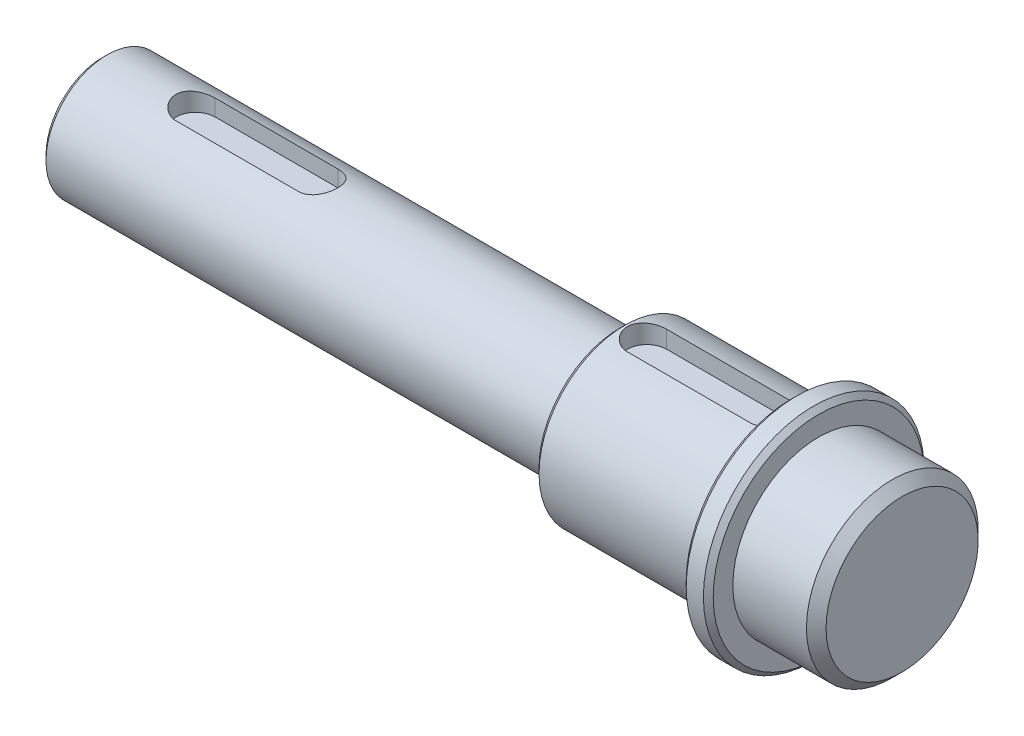
ISO-10303-21;
HEADER;
FILE_DESCRIPTION(('STEP AP214'),'2;1');
FILE_NAME('part.step','',(''),(''),'','','');
FILE_SCHEMA(('AUTOMOTIVE_DESIGN { 1 0 10303 214 1 1 1 1 }'));
ENDSEC;
DATA;
#1=APPLICATION_CONTEXT('core data for automotive mechanical design processes');
#2=APPLICATION_PROTOCOL_DEFINITION('international standard','automotive_design',2000,#1);
#3=PRODUCT_CONTEXT('',#1,'mechanical');
#4=PRODUCT('Part','Part','',(#3));
#5=PRODUCT_RELATED_PRODUCT_CATEGORY('part','',(#4));
#6=PRODUCT_DEFINITION_FORMATION('','',#4);
#7=PRODUCT_DEFINITION_CONTEXT('part definition',#1,'design');
#8=PRODUCT_DEFINITION('design','',#6,#7);
#9=PRODUCT_DEFINITION_SHAPE('','',#8);
#10=(LENGTH_UNIT() NAMED_UNIT(*) SI_UNIT(.MILLI.,.METRE.));
#11=(NAMED_UNIT(*) PLANE_ANGLE_UNIT() SI_UNIT($,.RADIAN.));
#12=(NAMED_UNIT(*) SI_UNIT($,.STERADIAN.) SOLID_ANGLE_UNIT());
#13=UNCERTAINTY_MEASURE_WITH_UNIT(LENGTH_MEASURE(1.E-05),#10,'distance_accuracy_value','');
#14=(GEOMETRIC_REPRESENTATION_CONTEXT(3) GLOBAL_UNCERTAINTY_ASSIGNED_CONTEXT((#13)) GLOBAL_UNIT_ASSIGNED_CONTEXT((#10,
#11,#12)) REPRESENTATION_CONTEXT('',''));
#15=CARTESIAN_POINT('',(0.,0.,0.));
#16=DIRECTION('',(0.,0.,1.));
#17=DIRECTION('',(1.,0.,0.));
#18=AXIS2_PLACEMENT_3D('',#15,#16,#17);
#19=CARTESIAN_POINT('',(-79.2890995260664,0.,0.));
#20=DIRECTION('',(-1.,0.,0.));
#21=DIRECTION('',(0.,0.,1.));
#22=AXIS2_PLACEMENT_3D('',#19,#20,#21);
#23=CYLINDRICAL_SURFACE('',#22,12.4832398510308);
#24=CARTESIAN_POINT('',(-125.043142843842,0.,0.));
#25=DIRECTION('',(-1.,0.,0.));
#26=DIRECTION('',(0.,0.,1.));
#27=AXIS2_PLACEMENT_3D('',#24,#25,#26);
#28=CIRCLE('',#27,12.4832398510308);
#29=CARTESIAN_POINT('',(-125.043142843842,0.,12.4832398510308));
#30=VERTEX_POINT('',#29);
#31=EDGE_CURVE('E11',#30,#30,#28,.F.);
#32=ORIENTED_EDGE('',*,*,#31,.T.);
#33=EDGE_LOOP('',(#32));
#34=FACE_BOUND('',#33,.T.);
#35=DIRECTION('',(-1.,0.,0.));
#36=VECTOR('',#35,1.);
#37=CARTESIAN_POINT('',(-79.2890995260664,11.82502757622,-4.));
#38=LINE('',#37,#36);
#39=CARTESIAN_POINT('',(-107.043142843842,11.82502757622,-4.));
#40=VERTEX_POINT('',#39);
#41=CARTESIAN_POINT('',(-82.0431428438418,11.82502757622,-4.));
#42=VERTEX_POINT('',#41);
#43=EDGE_CURVE('E426',#40,#42,#38,.F.);
#44=ORIENTED_EDGE('',*,*,#43,.T.);
#45=CARTESIAN_POINT('',(-82.0431428438418,11.82502757622,-4.));
#46=CARTESIAN_POINT('',(-81.9337515404454,11.8250110031127,-4.0000141137222));
#47=CARTESIAN_POINT('',(-81.8243695835167,11.8265451313554,-3.99551287069167));
#48=CARTESIAN_POINT('',(-81.6064486273469,11.8325915040989,-3.97758956200591));
#49=CARTESIAN_POINT('',(-81.4979094228663,11.8371029989239,-3.96416974196717));
#50=CARTESIAN_POINT('',(-81.282742261373,11.8489644014943,-3.9285686880446));
#51=CARTESIAN_POINT('',(-81.1761098251397,11.8563063731005,-3.90641194695838));
#52=CARTESIAN_POINT('',(-80.9652252937544,11.8735891478761,-3.8535601719357));
#53=CARTESIAN_POINT('',(-80.8609732751224,11.8835300344618,-3.82286486393878));
#54=CARTESIAN_POINT('',(-80.5529629596767,11.9168131900237,-3.7183665217657));
#55=CARTESIAN_POINT('',(-80.3536498105849,11.9436337977339,-3.63210075005935));
#56=CARTESIAN_POINT('',(-79.972307210485,12.0034992290161,-3.42905556019268));
#57=CARTESIAN_POINT('',(-79.7902874267558,12.03654750352,-3.3122592101887));
#58=CARTESIAN_POINT('',(-79.4420901346098,12.1064743176933,-3.04695637291666));
#59=CARTESIAN_POINT('',(-79.2766218492057,12.1434425605695,-2.89754085181971));
#60=CARTESIAN_POINT('',(-78.9726133889303,12.2162837652139,-2.57318506510693));
#61=CARTESIAN_POINT('',(-78.8340779053559,12.252156535251,-2.39824036195799));
#62=CARTESIAN_POINT('',(-78.5846754431944,12.3198007858832,-2.02262376587463));
#63=CARTESIAN_POINT('',(-78.4745491670526,12.3514537051938,-1.82143677525294));
#64=CARTESIAN_POINT('',(-78.2899839080282,12.4060334467591,-1.40221623014474));
#65=CARTESIAN_POINT('',(-78.2155347049385,12.4289627676248,-1.18418752101579));
#66=CARTESIAN_POINT('',(-78.1068284529817,12.4628752417648,-0.744947594997114));
#67=CARTESIAN_POINT('',(-78.0713496428594,12.474220697158,-0.524067239269295));
#68=CARTESIAN_POINT('',(-78.0377151163119,12.484969242915,-0.0792123550784674));
#69=CARTESIAN_POINT('',(-78.0395512383686,12.4843749447408,0.144761486068363));
#70=CARTESIAN_POINT('',(-78.0797027036522,12.4715602391351,0.580820166039402));
#71=CARTESIAN_POINT('',(-78.116692070213,12.4597624390652,0.793041523725626));
#72=CARTESIAN_POINT('',(-78.2239180802289,12.4263903019181,1.20808577683661));
#73=CARTESIAN_POINT('',(-78.2941565353966,12.4048154320998,1.4109081594585));
#74=CARTESIAN_POINT('',(-78.4667074332672,12.3537570546547,1.80439964540674));
#75=CARTESIAN_POINT('',(-78.5694130730951,12.3241772709371,1.99488329429804));
#76=CARTESIAN_POINT('',(-78.8036735613444,12.2602110735122,2.35631866367431));
#77=CARTESIAN_POINT('',(-78.9352357318324,12.2258234406639,2.52726541008281));
#78=CARTESIAN_POINT('',(-79.2301841181759,12.1541216823786,2.85264514906441));
#79=CARTESIAN_POINT('',(-79.3947081084184,12.1167453325952,3.00603265335917));
#80=CARTESIAN_POINT('',(-79.7476343831557,12.0445394669678,3.28343677036456));
#81=CARTESIAN_POINT('',(-79.9360440113753,12.009710739615,3.40744431631939));
#82=CARTESIAN_POINT('',(-80.2339876148793,11.9622102944545,3.56931543561853));
#83=CARTESIAN_POINT('',(-80.3366127463039,11.9470804599342,3.61950747953244));
#84=CARTESIAN_POINT('',(-80.546015410116,11.918973471828,3.71101626980851));
#85=CARTESIAN_POINT('',(-80.6527912041457,11.9059954287798,3.75233668543145));
#86=CARTESIAN_POINT('',(-80.8696253515857,11.8826265075836,3.82569571603121));
#87=CARTESIAN_POINT('',(-80.9796800457498,11.8722328580563,3.85774427978084));
#88=CARTESIAN_POINT('',(-81.2023156408048,11.8543646460776,3.91230588713122));
#89=CARTESIAN_POINT('',(-81.3148953587383,11.8468887456872,3.934823301659));
#90=CARTESIAN_POINT('',(-81.5299523758392,11.8357237464778,3.96827575654964));
#91=CARTESIAN_POINT('',(-81.6322652618139,11.8317221160491,3.98017046649224));
#92=CARTESIAN_POINT('',(-81.8374303986078,11.826369357653,3.99603268377225));
#93=CARTESIAN_POINT('',(-81.9402817163929,11.8250145993344,4.00001104901215));
#94=CARTESIAN_POINT('',(-82.0431428438418,11.82502757622,4.));
#95=B_SPLINE_CURVE_WITH_KNOTS('',3,(#45,#46,#47,#48,#49,#50,#51,#52,#53,#54,#55,#56,#57,#58,#59,
#60,#61,#62,#63,#64,#65,#66,#67,#68,#69,#70,#71,#72,#73,#74,#75,#76,#77,#78,#79,#80,#81,#82,#83,
#84,#85,#86,#87,#88,#89,#90,#91,#92,#93,#94),.UNSPECIFIED.,.F.,.F.,(4,2,2,2,2,2,2,2,2,2,2,2,2,2,
2,2,2,2,2,2,2,2,2,2,4),(0.,0.32805474326233,0.65602691660654,0.983086126435687,1.31015583502185,
1.96339087140417,2.61698895450837,3.29187832850458,3.9668851531564,4.65803039507009,
5.34897753002623,6.01758311440034,6.68604246300688,7.33024839482757,7.97448943288487,
8.62685249880989,9.27938128746748,9.96037124758603,10.6415710905933,10.9869281381389,
11.3321420714117,11.6769842016827,12.021668017663,12.3305720730896,12.6390521489492),.UNSPECIFIED.);
#96=CARTESIAN_POINT('',(-82.0431428438418,11.82502757622,4.));
#97=VERTEX_POINT('',#96);
#98=EDGE_CURVE('E272',#42,#97,#95,.T.);
#99=ORIENTED_EDGE('',*,*,#98,.T.);
#100=DIRECTION('',(-1.,0.,0.));
#101=VECTOR('',#100,1.);
#102=CARTESIAN_POINT('',(-79.2890995260664,11.82502757622,4.));
#103=LINE('',#102,#101);
#104=CARTESIAN_POINT('',(-107.043142843842,11.82502757622,4.));
#105=VERTEX_POINT('',#104);
#106=EDGE_CURVE('E286',#97,#105,#103,.T.);
#107=ORIENTED_EDGE('',*,*,#106,.T.);
#108=CARTESIAN_POINT('',(-107.043142843842,11.82502757622,4.));
#109=CARTESIAN_POINT('',(-107.152534147238,11.8250110031127,4.0000141137222));
#110=CARTESIAN_POINT('',(-107.261916104167,11.8265451313554,3.99551287069167));
#111=CARTESIAN_POINT('',(-107.479837060337,11.8325915040989,3.97758956200591));
#112=CARTESIAN_POINT('',(-107.588376264817,11.8371029989239,3.96416974196716));
#113=CARTESIAN_POINT('',(-107.803543426311,11.8489644014943,3.9285686880446));
#114=CARTESIAN_POINT('',(-107.910175862544,11.8563063731005,3.90641194695839));
#115=CARTESIAN_POINT('',(-108.121060393929,11.8735891478761,3.8535601719357));
#116=CARTESIAN_POINT('',(-108.225312412561,11.8835300344618,3.82286486393878));
#117=CARTESIAN_POINT('',(-108.533322728007,11.9168131900237,3.7183665217657));
#118=CARTESIAN_POINT('',(-108.732635877099,11.9436337977339,3.63210075005934));
#119=CARTESIAN_POINT('',(-109.113978477199,12.0034992290161,3.42905556019268));
#120=CARTESIAN_POINT('',(-109.295998260928,12.03654750352,3.3122592101887));
#121=CARTESIAN_POINT('',(-109.644195553074,12.1064743176933,3.04695637291666));
#122=CARTESIAN_POINT('',(-109.809663838478,12.1434425605695,2.89754085181969));
#123=CARTESIAN_POINT('',(-110.113672298753,12.2162837652139,2.57318506510691));
#124=CARTESIAN_POINT('',(-110.252207782328,12.252156535251,2.39824036195798));
#125=CARTESIAN_POINT('',(-110.501610244489,12.3198007858832,2.02262376587463));
#126=CARTESIAN_POINT('',(-110.611736520631,12.3514537051938,1.82143677525294));
#127=CARTESIAN_POINT('',(-110.796301779655,12.4060334467591,1.40221623014474));
#128=CARTESIAN_POINT('',(-110.870750982745,12.4289627676248,1.18418752101579));
#129=CARTESIAN_POINT('',(-110.979457234702,12.4628752417648,0.744947594997115));
#130=CARTESIAN_POINT('',(-111.014936044824,12.474220697158,0.524067239269295));
#131=CARTESIAN_POINT('',(-111.048570571372,12.484969242915,0.0792123550784681));
#132=CARTESIAN_POINT('',(-111.046734449315,12.4843749447408,-0.144761486068362));
#133=CARTESIAN_POINT('',(-111.006582984031,12.4715602391351,-0.580820166039402));
#134=CARTESIAN_POINT('',(-110.969593617471,12.4597624390652,-0.793041523725627));
#135=CARTESIAN_POINT('',(-110.862367607455,12.4263903019181,-1.20808577683661));
#136=CARTESIAN_POINT('',(-110.792129152287,12.4048154320998,-1.4109081594585));
#137=CARTESIAN_POINT('',(-110.619578254416,12.3537570546547,-1.80439964540674));
#138=CARTESIAN_POINT('',(-110.516872614588,12.3241772709371,-1.99488329429804));
#139=CARTESIAN_POINT('',(-110.282612126339,12.2602110735122,-2.35631866367431));
#140=CARTESIAN_POINT('',(-110.151049955851,12.2258234406639,-2.52726541008281));
#141=CARTESIAN_POINT('',(-109.856101569508,12.1541216823786,-2.85264514906441));
#142=CARTESIAN_POINT('',(-109.691577579265,12.1167453325952,-3.00603265335918));
#143=CARTESIAN_POINT('',(-109.338651304528,12.0445394669678,-3.28343677036456));
#144=CARTESIAN_POINT('',(-109.150241676308,12.009710739615,-3.40744431631939));
#145=CARTESIAN_POINT('',(-108.852298072804,11.9622102944545,-3.56931543561852));
#146=CARTESIAN_POINT('',(-108.74967294138,11.9470804599342,-3.61950747953244));
#147=CARTESIAN_POINT('',(-108.540270277568,11.918973471828,-3.7110162698085));
#148=CARTESIAN_POINT('',(-108.433494483538,11.9059954287798,-3.75233668543145));
#149=CARTESIAN_POINT('',(-108.216660336098,11.8826265075836,-3.82569571603121));
#150=CARTESIAN_POINT('',(-108.106605641934,11.8722328580563,-3.85774427978084));
#151=CARTESIAN_POINT('',(-107.883970046879,11.8543646460776,-3.91230588713122));
#152=CARTESIAN_POINT('',(-107.771390328945,11.8468887456872,-3.934823301659));
#153=CARTESIAN_POINT('',(-107.556333311844,11.8357237464778,-3.96827575654964));
#154=CARTESIAN_POINT('',(-107.45402042587,11.8317221160491,-3.98017046649224));
#155=CARTESIAN_POINT('',(-107.248855289076,11.826369357653,-3.99603268377225));
#156=CARTESIAN_POINT('',(-107.146003971291,11.8250145993344,-4.00001104901215));
#157=CARTESIAN_POINT('',(-107.043142843842,11.82502757622,-4.));
#158=B_SPLINE_CURVE_WITH_KNOTS('',3,(#108,#109,#110,#111,#112,#113,#114,#115,#116,#117,#118,
#119,#120,#121,#122,#123,#124,#125,#126,#127,#128,#129,#130,#131,#132,#133,#134,#135,#136,#137,
#138,#139,#140,#141,#142,#143,#144,#145,#146,#147,#148,#149,#150,#151,#152,#153,#154,#155,#156,
#157),.UNSPECIFIED.,.F.,.F.,(4,2,2,2,2,2,2,2,2,2,2,2,2,2,2,2,2,2,2,2,2,2,2,2,4),(0.,
0.328054743262344,0.65602691660654,0.983086126435644,1.31015583502185,1.96339087140419,
2.61698895450837,3.29187832850461,3.9668851531564,4.65803039507009,5.34897753002623,
6.01758311440033,6.68604246300688,7.33024839482757,7.97448943288487,8.62685249880989,
9.27938128746748,9.96037124758604,10.6415710905933,10.9869281381389,11.3321420714117,
11.6769842016826,12.021668017663,12.3305720730896,12.6390521489492),.UNSPECIFIED.);
#159=EDGE_CURVE('E51',#105,#40,#158,.T.);
#160=ORIENTED_EDGE('',*,*,#159,.T.);
#161=EDGE_LOOP('',(#44,#99,#107,#160));
#162=FACE_BOUND('',#161,.T.);
#163=CARTESIAN_POINT('',(-20.5512051427925,0.,0.));
#164=DIRECTION('',(-1.,0.,0.));
#165=DIRECTION('',(0.,0.,1.));
#166=AXIS2_PLACEMENT_3D('',#163,#164,#165);
#167=CIRCLE('',#166,12.4832398510308);
#168=CARTESIAN_POINT('',(-20.5512051427925,0.,12.4832398510308));
#169=VERTEX_POINT('',#168);
#170=EDGE_CURVE('E185',#169,#169,#167,.T.);
#171=ORIENTED_EDGE('',*,*,#170,.T.);
#172=EDGE_LOOP('',(#171));
#173=FACE_BOUND('',#172,.T.);
#174=ADVANCED_FACE('F35',(#34,#162,#173),#23,.T.);
#175=CARTESIAN_POINT('',(-20.5447499146006,0.,0.));
#176=DIRECTION('',(1.,0.,0.));
#177=DIRECTION('',(0.,0.,-1.));
#178=AXIS2_PLACEMENT_3D('',#175,#176,#177);
#179=CONICAL_SURFACE('',#178,16.500001291339,1.56918925534429);
#180=ORIENTED_EDGE('',*,*,#170,.F.);
#181=EDGE_LOOP('',(#180));
#182=FACE_BOUND('',#181,.T.);
#183=CARTESIAN_POINT('',(-20.5447499146006,0.,0.));
#184=DIRECTION('',(-1.,0.,0.));
#185=DIRECTION('',(0.,0.,1.));
#186=AXIS2_PLACEMENT_3D('',#183,#184,#185);
#187=CIRCLE('',#186,16.500001291339);
#188=CARTESIAN_POINT('',(-20.5447499146006,0.,16.500001291339));
#189=VERTEX_POINT('',#188);
#190=EDGE_CURVE('E182',#189,#189,#187,.T.);
#191=ORIENTED_EDGE('',*,*,#190,.T.);
#192=EDGE_LOOP('',(#191));
#193=FACE_BOUND('',#192,.T.);
#194=ADVANCED_FACE('F261',(#182,#193),#179,.T.);
#195=CARTESIAN_POINT('',(-19.5431428438418,0.,0.));
#196=DIRECTION('',(1.,0.,0.));
#197=DIRECTION('',(0.,0.,-1.));
#198=AXIS2_PLACEMENT_3D('',#195,#196,#197);
#199=CONICAL_SURFACE('',#198,17.5,0.784594627672144);
#200=ORIENTED_EDGE('',*,*,#190,.F.);
#201=EDGE_LOOP('',(#200));
#202=FACE_BOUND('',#201,.T.);
#203=CARTESIAN_POINT('',(-19.5431428438418,0.,0.));
#204=DIRECTION('',(-1.,0.,0.));
#205=DIRECTION('',(0.,0.,1.));
#206=AXIS2_PLACEMENT_3D('',#203,#204,#205);
#207=CIRCLE('',#206,17.5);
#208=CARTESIAN_POINT('',(-19.5431428438418,0.,17.5));
#209=VERTEX_POINT('',#208);
#210=EDGE_CURVE('E179',#209,#209,#207,.T.);
#211=ORIENTED_EDGE('',*,*,#210,.T.);
#212=EDGE_LOOP('',(#211));
#213=FACE_BOUND('',#212,.T.);
#214=ADVANCED_FACE('F256',(#202,#213),#199,.T.);
#215=CARTESIAN_POINT('',(-79.2890995260664,0.,0.));
#216=DIRECTION('',(-1.,0.,0.));
#217=DIRECTION('',(0.,0.,1.));
#218=AXIS2_PLACEMENT_3D('',#215,#216,#217);
#219=CYLINDRICAL_SURFACE('',#218,17.5);
#220=DIRECTION('',(-1.,0.,0.));
#221=VECTOR('',#220,1.);
#222=CARTESIAN_POINT('',(-79.2890995260664,17.0367250374008,-4.));
#223=LINE('',#222,#221);
#224=CARTESIAN_POINT('',(-15.0331753554502,17.0367250374008,-4.));
#225=VERTEX_POINT('',#224);
#226=CARTESIAN_POINT('',(9.96682464454978,17.0367250374008,-4.));
#227=VERTEX_POINT('',#226);
#228=EDGE_CURVE('E308',#225,#227,#223,.F.);
#229=ORIENTED_EDGE('',*,*,#228,.T.);
#230=CARTESIAN_POINT('',(9.96682464454978,17.0367250374008,-4.));
#231=CARTESIAN_POINT('',(10.0777564935695,17.0367138660067,-4.00001248231751));
#232=CARTESIAN_POINT('',(10.1886811675091,17.0378082617858,-3.99538546502867));
#233=CARTESIAN_POINT('',(10.409707211788,17.0421253952987,-3.97694932157872));
#234=CARTESIAN_POINT('',(10.5198087013615,17.0453478185126,-3.96314155232038));
#235=CARTESIAN_POINT('',(10.7382194094241,17.0538307536469,-3.92647318924765));
#236=CARTESIAN_POINT('',(10.8465314527527,17.059087651771,-3.90362864568808));
#237=CARTESIAN_POINT('',(11.0607655281195,17.0714746819689,-3.8490944107021));
#238=CARTESIAN_POINT('',(11.1666875379353,17.0786048314525,-3.81740463706963));
#239=CARTESIAN_POINT('',(11.4797596464848,17.1025105269156,-3.70940007909276));
#240=CARTESIAN_POINT('',(11.6824139303482,17.1218095761762,-3.6201165136919));
#241=CARTESIAN_POINT('',(12.0698058299077,17.1649441397841,-3.40971418070428));
#242=CARTESIAN_POINT('',(12.2545399685465,17.1887805318677,-3.28858925176468));
#243=CARTESIAN_POINT('',(12.6043307655271,17.2387926899631,-3.01555269417646));
#244=CARTESIAN_POINT('',(12.7690141101875,17.2650004661165,-2.86316778652959));
#245=CARTESIAN_POINT('',(13.0707241607244,17.3165247611238,-2.53295238865313));
#246=CARTESIAN_POINT('',(13.2077465158187,17.3418411392541,-2.3551179029788));
#247=CARTESIAN_POINT('',(13.4517449645885,17.3890809668325,-1.97651609742511));
#248=CARTESIAN_POINT('',(13.558356567215,17.410961949179,-1.77550809318057));
#249=CARTESIAN_POINT('',(13.7361375623255,17.4484992744045,-1.35785483515842));
#250=CARTESIAN_POINT('',(13.8073131356526,17.4641567027157,-1.14121231594595));
#251=CARTESIAN_POINT('',(13.9110196304699,17.4872566687127,-0.702348968435726));
#252=CARTESIAN_POINT('',(13.9441885563998,17.4948346770719,-0.480286158684642));
#253=CARTESIAN_POINT('',(13.9729373029082,17.5013922359856,-0.0336222528298657));
#254=CARTESIAN_POINT('',(13.9685209514387,17.5003726621791,0.190978582456415));
#255=CARTESIAN_POINT('',(13.9226935945377,17.489952340558,0.631926010215037));
#256=CARTESIAN_POINT('',(13.8819714396683,17.4807076590668,0.848348430712727));
#257=CARTESIAN_POINT('',(13.7657886794447,17.4550549045918,1.27120201757733));
#258=CARTESIAN_POINT('',(13.6903266978339,17.4386465478123,1.4776327877559));
#259=CARTESIAN_POINT('',(13.5062143640618,17.4002626903077,1.87652973429281));
#260=CARTESIAN_POINT('',(13.3973072846135,17.3782443578209,2.06887311134545));
#261=CARTESIAN_POINT('',(13.149581632536,17.3310474587669,2.43280009121924));
#262=CARTESIAN_POINT('',(13.0107594550459,17.3058685114888,2.60438118822771));
#263=CARTESIAN_POINT('',(12.7034665097011,17.2544419046369,2.92598580900956));
#264=CARTESIAN_POINT('',(12.5343969069737,17.2281829516239,3.0754348941749));
#265=CARTESIAN_POINT('',(12.173159341539,17.1780692090276,3.34405202485233));
#266=CARTESIAN_POINT('',(11.9809850869103,17.1542150775981,3.46321179425783));
#267=CARTESIAN_POINT('',(11.679202803394,17.1222689727167,3.61671597326183));
#268=CARTESIAN_POINT('',(11.5760743200484,17.1122387789592,3.66376574815988));
#269=CARTESIAN_POINT('',(11.3660864443802,17.0937715302981,3.7489839926838));
#270=CARTESIAN_POINT('',(11.2592285461217,17.0853338458964,3.78715597297674));
#271=CARTESIAN_POINT('',(11.0426572531314,17.0703178704533,3.8542742485837));
#272=CARTESIAN_POINT('',(10.9329469459531,17.0637376534167,3.88323010403838));
#273=CARTESIAN_POINT('',(10.7114056174011,17.0526294698307,3.93172314689819));
#274=CARTESIAN_POINT('',(10.5995756220362,17.0481005355421,3.95126477595514));
#275=CARTESIAN_POINT('',(10.4008275696961,17.0420340571271,3.97733749089981));
#276=CARTESIAN_POINT('',(10.3141762072353,17.0400453891908,3.98583914323426));
#277=CARTESIAN_POINT('',(10.1406273475216,17.0373899876292,3.99716769798061));
#278=CARTESIAN_POINT('',(10.0537304945129,17.0367210727584,4.00000396405785));
#279=CARTESIAN_POINT('',(9.96682464454978,17.0367250374008,4.));
#280=B_SPLINE_CURVE_WITH_KNOTS('',3,(#230,#231,#232,#233,#234,#235,#236,#237,#238,#239,#240,
#241,#242,#243,#244,#245,#246,#247,#248,#249,#250,#251,#252,#253,#254,#255,#256,#257,#258,#259,
#260,#261,#262,#263,#264,#265,#266,#267,#268,#269,#270,#271,#272,#273,#274,#275,#276,#277,#278,
#279),.UNSPECIFIED.,.F.,.F.,(4,2,2,2,2,2,2,2,2,2,2,2,2,2,2,2,2,2,2,2,2,2,2,2,4),(0.,
0.332681247866697,0.66531333682085,0.997357270100381,1.32940428944207,1.99290262989595,
2.65652945292504,3.33106339250549,4.00570334664101,4.68811868485082,5.37041495269124,
6.0410817607265,6.71168026410031,7.36981967360707,8.02798515827641,8.69133469760162,
9.35476421731793,10.0331782060872,10.7117773626502,11.0528239514451,11.3937354453644,
11.7342921410368,12.0746880036043,12.3357711604052,12.5964224446493),.UNSPECIFIED.);
#281=CARTESIAN_POINT('',(9.96682464454978,17.0367250374008,4.));
#282=VERTEX_POINT('',#281);
#283=EDGE_CURVE('E188',#227,#282,#280,.T.);
#284=ORIENTED_EDGE('',*,*,#283,.T.);
#285=DIRECTION('',(-1.,0.,0.));
#286=VECTOR('',#285,1.);
#287=CARTESIAN_POINT('',(-79.2890995260664,17.0367250374008,4.));
#288=LINE('',#287,#286);
#289=CARTESIAN_POINT('',(-15.0331753554502,17.0367250374008,4.));
#290=VERTEX_POINT('',#289);
#291=EDGE_CURVE('E305',#282,#290,#288,.T.);
#292=ORIENTED_EDGE('',*,*,#291,.T.);
#293=CARTESIAN_POINT('',(-15.0331753554502,17.0367250374008,4.));
#294=CARTESIAN_POINT('',(-15.14410720447,17.0367138660067,4.00001248231751));
#295=CARTESIAN_POINT('',(-15.2550318784095,17.0378082617858,3.99538546502866));
#296=CARTESIAN_POINT('',(-15.4760579226884,17.0421253952987,3.97694932157872));
#297=CARTESIAN_POINT('',(-15.5861594122619,17.0453478185126,3.96314155232038));
#298=CARTESIAN_POINT('',(-15.8045701203245,17.0538307536469,3.92647318924765));
#299=CARTESIAN_POINT('',(-15.9128821636531,17.059087651771,3.90362864568808));
#300=CARTESIAN_POINT('',(-16.1271162390199,17.0714746819689,3.8490944107021));
#301=CARTESIAN_POINT('',(-16.2330382488357,17.0786048314525,3.81740463706963));
#302=CARTESIAN_POINT('',(-16.5461103573852,17.1025105269156,3.70940007909276));
#303=CARTESIAN_POINT('',(-16.7487646412487,17.1218095761762,3.6201165136919));
#304=CARTESIAN_POINT('',(-17.1361565408081,17.1649441397841,3.40971418070428));
#305=CARTESIAN_POINT('',(-17.3208906794469,17.1887805318677,3.28858925176468));
#306=CARTESIAN_POINT('',(-17.6706814764275,17.2387926899631,3.01555269417646));
#307=CARTESIAN_POINT('',(-17.835364821088,17.2650004661165,2.8631677865296));
#308=CARTESIAN_POINT('',(-18.1370748716249,17.3165247611238,2.53295238865314));
#309=CARTESIAN_POINT('',(-18.2740972267192,17.3418411392541,2.35511790297881));
#310=CARTESIAN_POINT('',(-18.518095675489,17.3890809668325,1.97651609742511));
#311=CARTESIAN_POINT('',(-18.6247072781155,17.410961949179,1.77550809318057));
#312=CARTESIAN_POINT('',(-18.802488273226,17.4484992744045,1.35785483515843));
#313=CARTESIAN_POINT('',(-18.873663846553,17.4641567027157,1.14121231594596));
#314=CARTESIAN_POINT('',(-18.9773703413703,17.4872566687127,0.702348968435729));
#315=CARTESIAN_POINT('',(-19.0105392673003,17.4948346770719,0.480286158684644));
#316=CARTESIAN_POINT('',(-19.0392880138086,17.5013922359856,0.0336222528298676));
#317=CARTESIAN_POINT('',(-19.0348716623391,17.5003726621791,-0.190978582456413));
#318=CARTESIAN_POINT('',(-18.9890443054382,17.489952340558,-0.631926010215036));
#319=CARTESIAN_POINT('',(-18.9483221505687,17.4807076590668,-0.848348430712726));
#320=CARTESIAN_POINT('',(-18.8321393903451,17.4550549045918,-1.27120201757732));
#321=CARTESIAN_POINT('',(-18.7566774087343,17.4386465478123,-1.4776327877559));
#322=CARTESIAN_POINT('',(-18.5725650749622,17.4002626903077,-1.87652973429281));
#323=CARTESIAN_POINT('',(-18.463657995514,17.3782443578209,-2.06887311134545));
#324=CARTESIAN_POINT('',(-18.2159323434364,17.3310474587669,-2.43280009121923));
#325=CARTESIAN_POINT('',(-18.0771101659464,17.3058685114888,-2.60438118822771));
#326=CARTESIAN_POINT('',(-17.7698172206016,17.2544419046369,-2.92598580900956));
#327=CARTESIAN_POINT('',(-17.6007476178741,17.2281829516239,-3.0754348941749));
#328=CARTESIAN_POINT('',(-17.2395100524394,17.1780692090276,-3.34405202485233));
#329=CARTESIAN_POINT('',(-17.0473357978107,17.1542150775981,-3.46321179425783));
#330=CARTESIAN_POINT('',(-16.7455535142944,17.1222689727167,-3.61671597326183));
#331=CARTESIAN_POINT('',(-16.6424250309489,17.1122387789592,-3.66376574815988));
#332=CARTESIAN_POINT('',(-16.4324371552807,17.0937715302981,-3.7489839926838));
#333=CARTESIAN_POINT('',(-16.3255792570222,17.0853338458964,-3.78715597297673));
#334=CARTESIAN_POINT('',(-16.1090079640318,17.0703178704533,-3.8542742485837));
#335=CARTESIAN_POINT('',(-15.9992976568536,17.0637376534167,-3.88323010403838));
#336=CARTESIAN_POINT('',(-15.7777563283015,17.0526294698307,-3.9317231468982));
#337=CARTESIAN_POINT('',(-15.6659263329366,17.0481005355421,-3.95126477595514));
#338=CARTESIAN_POINT('',(-15.4671782805966,17.0420340571271,-3.97733749089981));
#339=CARTESIAN_POINT('',(-15.3805269181357,17.0400453891908,-3.98583914323426));
#340=CARTESIAN_POINT('',(-15.206978058422,17.0373899876292,-3.99716769798061));
#341=CARTESIAN_POINT('',(-15.1200812054133,17.0367210727584,-4.00000396405785));
#342=CARTESIAN_POINT('',(-15.0331753554502,17.0367250374008,-4.));
#343=B_SPLINE_CURVE_WITH_KNOTS('',3,(#293,#294,#295,#296,#297,#298,#299,#300,#301,#302,#303,
#304,#305,#306,#307,#308,#309,#310,#311,#312,#313,#314,#315,#316,#317,#318,#319,#320,#321,#322,
#323,#324,#325,#326,#327,#328,#329,#330,#331,#332,#333,#334,#335,#336,#337,#338,#339,#340,#341,
#342),.UNSPECIFIED.,.F.,.F.,(4,2,2,2,2,2,2,2,2,2,2,2,2,2,2,2,2,2,2,2,2,2,2,2,4),(0.,
0.332681247866697,0.66531333682085,0.99735727010038,1.32940428944207,1.99290262989595,
2.65652945292504,3.33106339250548,4.00570334664101,4.68811868485081,5.37041495269124,
6.0410817607265,6.71168026410031,7.36981967360707,8.02798515827641,8.69133469760162,
9.35476421731793,10.0331782060872,10.7117773626502,11.0528239514451,11.3937354453644,
11.7342921410368,12.0746880036043,12.3357711604052,12.5964224446493),.UNSPECIFIED.);
#344=EDGE_CURVE('E59',#290,#225,#343,.T.);
#345=ORIENTED_EDGE('',*,*,#344,.T.);
#346=EDGE_LOOP('',(#229,#284,#292,#345));
#347=FACE_BOUND('',#346,.T.);
#348=ORIENTED_EDGE('',*,*,#210,.F.);
#349=EDGE_LOOP('',(#348));
#350=FACE_BOUND('',#349,.T.);
#351=CARTESIAN_POINT('',(14.4568571561582,0.,0.));
#352=DIRECTION('',(-1.,0.,0.));
#353=DIRECTION('',(0.,0.,1.));
#354=AXIS2_PLACEMENT_3D('',#351,#352,#353);
#355=CIRCLE('',#354,17.5);
#356=CARTESIAN_POINT('',(14.4568571561582,0.,17.5));
#357=VERTEX_POINT('',#356);
#358=EDGE_CURVE('E176',#357,#357,#355,.T.);
#359=ORIENTED_EDGE('',*,*,#358,.T.);
#360=EDGE_LOOP('',(#359));
#361=FACE_BOUND('',#360,.T.);
#362=ADVANCED_FACE('F203',(#347,#350,#361),#219,.T.);
#363=CARTESIAN_POINT('',(14.4568571561582,17.5,0.));
#364=DIRECTION('',(1.,0.,0.));
#365=DIRECTION('',(0.,0.,-1.));
#366=AXIS2_PLACEMENT_3D('',#363,#364,#365);
#367=PLANE('',#366);
#368=ORIENTED_EDGE('',*,*,#358,.F.);
#369=EDGE_LOOP('',(#368));
#370=FACE_BOUND('',#369,.T.);
#371=CARTESIAN_POINT('',(14.4568571561582,0.,0.));
#372=DIRECTION('',(-1.,0.,0.));
#373=DIRECTION('',(0.,0.,1.));
#374=AXIS2_PLACEMENT_3D('',#371,#372,#373);
#375=CIRCLE('',#374,21.5);
#376=CARTESIAN_POINT('',(14.4568571561582,0.,21.5));
#377=VERTEX_POINT('',#376);
#378=EDGE_CURVE('E173',#377,#377,#375,.T.);
#379=ORIENTED_EDGE('',*,*,#378,.T.);
#380=EDGE_LOOP('',(#379));
#381=FACE_BOUND('',#380,.T.);
#382=ADVANCED_FACE('F249',(#370,#381),#367,.F.);
#383=CARTESIAN_POINT('',(15.4568571561582,0.,0.));
#384=DIRECTION('',(1.,0.,0.));
#385=DIRECTION('',(0.,0.,-1.));
#386=AXIS2_PLACEMENT_3D('',#383,#384,#385);
#387=CONICAL_SURFACE('',#386,22.5,0.785398163397448);
#388=ORIENTED_EDGE('',*,*,#378,.F.);
#389=EDGE_LOOP('',(#388));
#390=FACE_BOUND('',#389,.T.);
#391=CARTESIAN_POINT('',(15.4568571561582,0.,0.));
#392=DIRECTION('',(-1.,0.,0.));
#393=DIRECTION('',(0.,0.,1.));
#394=AXIS2_PLACEMENT_3D('',#391,#392,#393);
#395=CIRCLE('',#394,22.5);
#396=CARTESIAN_POINT('',(15.4568571561582,0.,22.5));
#397=VERTEX_POINT('',#396);
#398=EDGE_CURVE('E170',#397,#397,#395,.T.);
#399=ORIENTED_EDGE('',*,*,#398,.T.);
#400=EDGE_LOOP('',(#399));
#401=FACE_BOUND('',#400,.T.);
#402=ADVANCED_FACE('F246',(#390,#401),#387,.T.);
#403=CARTESIAN_POINT('',(-79.2890995260664,0.,0.));
#404=DIRECTION('',(-1.,0.,0.));
#405=DIRECTION('',(0.,0.,1.));
#406=AXIS2_PLACEMENT_3D('',#403,#404,#405);
#407=CYLINDRICAL_SURFACE('',#406,22.5);
#408=ORIENTED_EDGE('',*,*,#398,.F.);
#409=EDGE_LOOP('',(#408));
#410=FACE_BOUND('',#409,.T.);
#411=CARTESIAN_POINT('',(18.9568571561582,0.,0.));
#412=DIRECTION('',(-1.,0.,0.));
#413=DIRECTION('',(0.,0.,1.));
#414=AXIS2_PLACEMENT_3D('',#411,#412,#413);
#415=CIRCLE('',#414,22.5);
#416=CARTESIAN_POINT('',(18.9568571561582,0.,22.5));
#417=VERTEX_POINT('',#416);
#418=EDGE_CURVE('E167',#417,#417,#415,.T.);
#419=ORIENTED_EDGE('',*,*,#418,.T.);
#420=EDGE_LOOP('',(#419));
#421=FACE_BOUND('',#420,.T.);
#422=ADVANCED_FACE('F242',(#410,#421),#407,.T.);
#423=CARTESIAN_POINT('',(19.9568571561582,0.,0.));
#424=DIRECTION('',(-1.,0.,0.));
#425=DIRECTION('',(0.,0.,1.));
#426=AXIS2_PLACEMENT_3D('',#423,#424,#425);
#427=CONICAL_SURFACE('',#426,21.5,0.785398163397448);
#428=ORIENTED_EDGE('',*,*,#418,.F.);
#429=EDGE_LOOP('',(#428));
#430=FACE_BOUND('',#429,.T.);
#431=CARTESIAN_POINT('',(19.9568571561582,0.,0.));
#432=DIRECTION('',(-1.,0.,0.));
#433=DIRECTION('',(0.,0.,1.));
#434=AXIS2_PLACEMENT_3D('',#431,#432,#433);
#435=CIRCLE('',#434,21.5);
#436=CARTESIAN_POINT('',(19.9568571561582,0.,21.5));
#437=VERTEX_POINT('',#436);
#438=EDGE_CURVE('E164',#437,#437,#435,.T.);
#439=ORIENTED_EDGE('',*,*,#438,.T.);
#440=EDGE_LOOP('',(#439));
#441=FACE_BOUND('',#440,.T.);
#442=ADVANCED_FACE('F238',(#430,#441),#427,.T.);
#443=CARTESIAN_POINT('',(19.9568571561582,21.5,0.));
#444=DIRECTION('',(-1.,0.,0.));
#445=DIRECTION('',(0.,0.,1.));
#446=AXIS2_PLACEMENT_3D('',#443,#444,#445);
#447=PLANE('',#446);
#448=ORIENTED_EDGE('',*,*,#438,.F.);
#449=EDGE_LOOP('',(#448));
#450=FACE_BOUND('',#449,.T.);
#451=CARTESIAN_POINT('',(19.9568571561582,0.,0.));
#452=DIRECTION('',(-1.,0.,0.));
#453=DIRECTION('',(0.,0.,1.));
#454=AXIS2_PLACEMENT_3D('',#451,#452,#453);
#455=CIRCLE('',#454,17.5);
#456=CARTESIAN_POINT('',(19.9568571561582,0.,17.5));
#457=VERTEX_POINT('',#456);
#458=EDGE_CURVE('E161',#457,#457,#455,.T.);
#459=ORIENTED_EDGE('',*,*,#458,.T.);
#460=EDGE_LOOP('',(#459));
#461=FACE_BOUND('',#460,.T.);
#462=ADVANCED_FACE('F234',(#450,#461),#447,.F.);
#463=CARTESIAN_POINT('',(-79.2890995260664,0.,0.));
#464=DIRECTION('',(-1.,0.,0.));
#465=DIRECTION('',(0.,0.,1.));
#466=AXIS2_PLACEMENT_3D('',#463,#464,#465);
#467=CYLINDRICAL_SURFACE('',#466,17.5);
#468=ORIENTED_EDGE('',*,*,#458,.F.);
#469=EDGE_LOOP('',(#468));
#470=FACE_BOUND('',#469,.T.);
#471=CARTESIAN_POINT('',(34.9568571561582,0.,0.));
#472=DIRECTION('',(-1.,0.,0.));
#473=DIRECTION('',(0.,0.,1.));
#474=AXIS2_PLACEMENT_3D('',#471,#472,#473);
#475=CIRCLE('',#474,17.5);
#476=CARTESIAN_POINT('',(34.9568571561582,0.,17.5));
#477=VERTEX_POINT('',#476);
#478=EDGE_CURVE('E158',#477,#477,#475,.T.);
#479=ORIENTED_EDGE('',*,*,#478,.T.);
#480=EDGE_LOOP('',(#479));
#481=FACE_BOUND('',#480,.T.);
#482=ADVANCED_FACE('F230',(#470,#481),#467,.T.);
#483=CARTESIAN_POINT('',(36.9568571561582,0.,0.));
#484=DIRECTION('',(-1.,0.,0.));
#485=DIRECTION('',(0.,0.,1.));
#486=AXIS2_PLACEMENT_3D('',#483,#484,#485);
#487=CONICAL_SURFACE('',#486,15.5,0.785398163397445);
#488=ORIENTED_EDGE('',*,*,#478,.F.);
#489=EDGE_LOOP('',(#488));
#490=FACE_BOUND('',#489,.T.);
#491=CARTESIAN_POINT('',(36.9568571561582,0.,0.));
#492=DIRECTION('',(-1.,0.,0.));
#493=DIRECTION('',(0.,0.,1.));
#494=AXIS2_PLACEMENT_3D('',#491,#492,#493);
#495=CIRCLE('',#494,15.5);
#496=CARTESIAN_POINT('',(36.9568571561582,0.,15.5));
#497=VERTEX_POINT('',#496);
#498=EDGE_CURVE('E148',#497,#497,#495,.T.);
#499=ORIENTED_EDGE('',*,*,#498,.T.);
#500=EDGE_LOOP('',(#499));
#501=FACE_BOUND('',#500,.T.);
#502=ADVANCED_FACE('F226',(#490,#501),#487,.T.);
#503=CARTESIAN_POINT('',(36.9568571561582,15.5,0.));
#504=DIRECTION('',(-1.,0.,0.));
#505=DIRECTION('',(0.,0.,1.));
#506=AXIS2_PLACEMENT_3D('',#503,#504,#505);
#507=PLANE('',#506);
#508=ORIENTED_EDGE('',*,*,#498,.F.);
#509=EDGE_LOOP('',(#508));
#510=FACE_BOUND('',#509,.T.);
#511=ADVANCED_FACE('F223',(#510),#507,.F.);
#512=CARTESIAN_POINT('',(-15.0331753554502,13.5,0.));
#513=DIRECTION('',(0.,1.,0.));
#514=DIRECTION('',(0.,0.,1.));
#515=AXIS2_PLACEMENT_3D('',#512,#513,#514);
#516=CYLINDRICAL_SURFACE('',#515,4.);
#517=DIRECTION('',(0.,1.,0.));
#518=VECTOR('',#517,1.);
#519=CARTESIAN_POINT('',(-15.0331753554502,13.5,4.));
#520=LINE('',#519,#518);
#521=CARTESIAN_POINT('',(-15.0331753554502,13.5,4.));
#522=VERTEX_POINT('',#521);
#523=EDGE_CURVE('E145',#522,#290,#520,.T.);
#524=ORIENTED_EDGE('',*,*,#523,.F.);
#525=CARTESIAN_POINT('',(-15.0331753554502,13.5,0.));
#526=DIRECTION('',(0.,1.,0.));
#527=DIRECTION('',(0.,0.,1.));
#528=AXIS2_PLACEMENT_3D('',#525,#526,#527);
#529=CIRCLE('',#528,4.);
#530=CARTESIAN_POINT('',(-15.0331753554502,13.5,-4.));
#531=VERTEX_POINT('',#530);
#532=EDGE_CURVE('E129',#531,#522,#529,.T.);
#533=ORIENTED_EDGE('',*,*,#532,.F.);
#534=DIRECTION('',(0.,1.,0.));
#535=VECTOR('',#534,1.);
#536=CARTESIAN_POINT('',(-15.0331753554502,13.5,-4.));
#537=LINE('',#536,#535);
#538=EDGE_CURVE('E146',#531,#225,#537,.T.);
#539=ORIENTED_EDGE('',*,*,#538,.T.);
#540=ORIENTED_EDGE('',*,*,#344,.F.);
#541=EDGE_LOOP('',(#524,#533,#539,#540));
#542=FACE_BOUND('',#541,.T.);
#543=ADVANCED_FACE('F219',(#542),#516,.F.);
#544=CARTESIAN_POINT('',(-15.0331753554502,13.5,-4.));
#545=DIRECTION('',(0.,0.,-1.));
#546=DIRECTION('',(-1.,0.,0.));
#547=AXIS2_PLACEMENT_3D('',#544,#545,#546);
#548=PLANE('',#547);
#549=ORIENTED_EDGE('',*,*,#538,.F.);
#550=DIRECTION('',(-1.,0.,0.));
#551=VECTOR('',#550,1.);
#552=CARTESIAN_POINT('',(-15.0331753554502,13.5,-4.));
#553=LINE('',#552,#551);
#554=CARTESIAN_POINT('',(9.96682464454978,13.5,-4.));
#555=VERTEX_POINT('',#554);
#556=EDGE_CURVE('E142',#555,#531,#553,.T.);
#557=ORIENTED_EDGE('',*,*,#556,.F.);
#558=DIRECTION('',(0.,1.,0.));
#559=VECTOR('',#558,1.);
#560=CARTESIAN_POINT('',(9.96682464454978,13.5,-4.));
#561=LINE('',#560,#559);
#562=EDGE_CURVE('E149',#555,#227,#561,.T.);
#563=ORIENTED_EDGE('',*,*,#562,.T.);
#564=ORIENTED_EDGE('',*,*,#228,.F.);
#565=EDGE_LOOP('',(#549,#557,#563,#564));
#566=FACE_BOUND('',#565,.T.);
#567=ADVANCED_FACE('F213',(#566),#548,.F.);
#568=CARTESIAN_POINT('',(9.96682464454978,13.5,0.));
#569=DIRECTION('',(0.,1.,0.));
#570=DIRECTION('',(0.,0.,1.));
#571=AXIS2_PLACEMENT_3D('',#568,#569,#570);
#572=CYLINDRICAL_SURFACE('',#571,4.);
#573=ORIENTED_EDGE('',*,*,#562,.F.);
#574=CARTESIAN_POINT('',(9.96682464454978,13.5,0.));
#575=DIRECTION('',(0.,1.,0.));
#576=DIRECTION('',(0.,0.,1.));
#577=AXIS2_PLACEMENT_3D('',#574,#575,#576);
#578=CIRCLE('',#577,4.);
#579=CARTESIAN_POINT('',(9.96682464454978,13.5,4.));
#580=VERTEX_POINT('',#579);
#581=EDGE_CURVE('E139',#580,#555,#578,.T.);
#582=ORIENTED_EDGE('',*,*,#581,.F.);
#583=DIRECTION('',(0.,1.,0.));
#584=VECTOR('',#583,1.);
#585=CARTESIAN_POINT('',(9.96682464454978,13.5,4.));
#586=LINE('',#585,#584);
#587=EDGE_CURVE('E152',#580,#282,#586,.T.);
#588=ORIENTED_EDGE('',*,*,#587,.T.);
#589=ORIENTED_EDGE('',*,*,#283,.F.);
#590=EDGE_LOOP('',(#573,#582,#588,#589));
#591=FACE_BOUND('',#590,.T.);
#592=ADVANCED_FACE('F207',(#591),#572,.F.);
#593=CARTESIAN_POINT('',(-15.0331753554502,13.5,4.));
#594=DIRECTION('',(0.,0.,1.));
#595=DIRECTION('',(1.,0.,0.));
#596=AXIS2_PLACEMENT_3D('',#593,#594,#595);
#597=PLANE('',#596);
#598=ORIENTED_EDGE('',*,*,#587,.F.);
#599=DIRECTION('',(1.,0.,0.));
#600=VECTOR('',#599,1.);
#601=CARTESIAN_POINT('',(-15.0331753554502,13.5,4.));
#602=LINE('',#601,#600);
#603=EDGE_CURVE('E136',#522,#580,#602,.T.);
#604=ORIENTED_EDGE('',*,*,#603,.F.);
#605=ORIENTED_EDGE('',*,*,#523,.T.);
#606=ORIENTED_EDGE('',*,*,#291,.F.);
#607=EDGE_LOOP('',(#598,#604,#605,#606));
#608=FACE_BOUND('',#607,.T.);
#609=ADVANCED_FACE('F212',(#608),#597,.F.);
#610=CARTESIAN_POINT('',(-15.0331753554502,13.5,0.));
#611=DIRECTION('',(0.,1.,0.));
#612=DIRECTION('',(0.,0.,1.));
#613=AXIS2_PLACEMENT_3D('',#610,#611,#612);
#614=PLANE('',#613);
#615=ORIENTED_EDGE('',*,*,#532,.T.);
#616=ORIENTED_EDGE('',*,*,#603,.T.);
#617=ORIENTED_EDGE('',*,*,#581,.T.);
#618=ORIENTED_EDGE('',*,*,#556,.T.);
#619=EDGE_LOOP('',(#615,#616,#617,#618));
#620=FACE_BOUND('',#619,.T.);
#621=ADVANCED_FACE('F217',(#620),#614,.T.);
#622=CARTESIAN_POINT('',(-126.043142843842,0.,0.));
#623=DIRECTION('',(-1.,0.,0.));
#624=DIRECTION('',(0.,0.,1.));
#625=AXIS2_PLACEMENT_3D('',#622,#623,#624);
#626=PLANE('',#625);
#627=CARTESIAN_POINT('',(-126.043142843842,0.,0.));
#628=DIRECTION('',(-1.,0.,0.));
#629=DIRECTION('',(0.,0.,1.));
#630=AXIS2_PLACEMENT_3D('',#627,#628,#629);
#631=CIRCLE('',#630,11.4832398510308);
#632=CARTESIAN_POINT('',(-126.043142843842,0.,11.4832398510308));
#633=VERTEX_POINT('',#632);
#634=EDGE_CURVE('E44',#633,#633,#631,.T.);
#635=ORIENTED_EDGE('',*,*,#634,.T.);
#636=EDGE_LOOP('',(#635));
#637=FACE_BOUND('',#636,.T.);
#638=ADVANCED_FACE('F293',(#637),#626,.T.);
#639=CARTESIAN_POINT('',(-107.043142843842,8.48323985103084,0.));
#640=DIRECTION('',(0.,1.,0.));
#641=DIRECTION('',(0.,0.,1.));
#642=AXIS2_PLACEMENT_3D('',#639,#640,#641);
#643=CYLINDRICAL_SURFACE('',#642,4.);
#644=DIRECTION('',(0.,1.,0.));
#645=VECTOR('',#644,1.);
#646=CARTESIAN_POINT('',(-107.043142843842,8.48323985103084,4.));
#647=LINE('',#646,#645);
#648=CARTESIAN_POINT('',(-107.043142843842,8.48323985103084,4.));
#649=VERTEX_POINT('',#648);
#650=EDGE_CURVE('E101',#649,#105,#647,.T.);
#651=ORIENTED_EDGE('',*,*,#650,.F.);
#652=CARTESIAN_POINT('',(-107.043142843842,8.48323985103084,0.));
#653=DIRECTION('',(0.,1.,0.));
#654=DIRECTION('',(0.,0.,1.));
#655=AXIS2_PLACEMENT_3D('',#652,#653,#654);
#656=CIRCLE('',#655,4.);
#657=CARTESIAN_POINT('',(-107.043142843842,8.48323985103084,-4.));
#658=VERTEX_POINT('',#657);
#659=EDGE_CURVE('E105',#658,#649,#656,.T.);
#660=ORIENTED_EDGE('',*,*,#659,.F.);
#661=DIRECTION('',(0.,1.,0.));
#662=VECTOR('',#661,1.);
#663=CARTESIAN_POINT('',(-107.043142843842,8.48323985103084,-4.));
#664=LINE('',#663,#662);
#665=EDGE_CURVE('E127',#658,#40,#664,.T.);
#666=ORIENTED_EDGE('',*,*,#665,.T.);
#667=ORIENTED_EDGE('',*,*,#159,.F.);
#668=EDGE_LOOP('',(#651,#660,#666,#667));
#669=FACE_BOUND('',#668,.T.);
#670=ADVANCED_FACE('F103',(#669),#643,.F.);
#671=CARTESIAN_POINT('',(-107.043142843842,8.48323985103084,-4.));
#672=DIRECTION('',(0.,0.,-1.));
#673=DIRECTION('',(-1.,0.,0.));
#674=AXIS2_PLACEMENT_3D('',#671,#672,#673);
#675=PLANE('',#674);
#676=ORIENTED_EDGE('',*,*,#665,.F.);
#677=DIRECTION('',(-1.,0.,0.));
#678=VECTOR('',#677,1.);
#679=CARTESIAN_POINT('',(-107.043142843842,8.48323985103084,-4.));
#680=LINE('',#679,#678);
#681=CARTESIAN_POINT('',(-82.0431428438418,8.48323985103084,-4.));
#682=VERTEX_POINT('',#681);
#683=EDGE_CURVE('E110',#682,#658,#680,.T.);
#684=ORIENTED_EDGE('',*,*,#683,.F.);
#685=DIRECTION('',(0.,1.,0.));
#686=VECTOR('',#685,1.);
#687=CARTESIAN_POINT('',(-82.0431428438418,8.48323985103084,-4.));
#688=LINE('',#687,#686);
#689=EDGE_CURVE('E130',#682,#42,#688,.T.);
#690=ORIENTED_EDGE('',*,*,#689,.T.);
#691=ORIENTED_EDGE('',*,*,#43,.F.);
#692=EDGE_LOOP('',(#676,#684,#690,#691));
#693=FACE_BOUND('',#692,.T.);
#694=ADVANCED_FACE('F292',(#693),#675,.F.);
#695=CARTESIAN_POINT('',(-82.0431428438418,8.48323985103084,0.));
#696=DIRECTION('',(0.,1.,0.));
#697=DIRECTION('',(0.,0.,1.));
#698=AXIS2_PLACEMENT_3D('',#695,#696,#697);
#699=CYLINDRICAL_SURFACE('',#698,4.);
#700=ORIENTED_EDGE('',*,*,#689,.F.);
#701=CARTESIAN_POINT('',(-82.0431428438418,8.48323985103084,0.));
#702=DIRECTION('',(0.,1.,0.));
#703=DIRECTION('',(0.,0.,1.));
#704=AXIS2_PLACEMENT_3D('',#701,#702,#703);
#705=CIRCLE('',#704,4.);
#706=CARTESIAN_POINT('',(-82.0431428438418,8.48323985103084,4.));
#707=VERTEX_POINT('',#706);
#708=EDGE_CURVE('E119',#707,#682,#705,.T.);
#709=ORIENTED_EDGE('',*,*,#708,.F.);
#710=DIRECTION('',(0.,1.,0.));
#711=VECTOR('',#710,1.);
#712=CARTESIAN_POINT('',(-82.0431428438418,8.48323985103084,4.));
#713=LINE('',#712,#711);
#714=EDGE_CURVE('E109',#707,#97,#713,.T.);
#715=ORIENTED_EDGE('',*,*,#714,.T.);
#716=ORIENTED_EDGE('',*,*,#98,.F.);
#717=EDGE_LOOP('',(#700,#709,#715,#716));
#718=FACE_BOUND('',#717,.T.);
#719=ADVANCED_FACE('F377',(#718),#699,.F.);
#720=CARTESIAN_POINT('',(-107.043142843842,8.48323985103084,4.));
#721=DIRECTION('',(0.,0.,1.));
#722=DIRECTION('',(1.,0.,0.));
#723=AXIS2_PLACEMENT_3D('',#720,#721,#722);
#724=PLANE('',#723);
#725=ORIENTED_EDGE('',*,*,#714,.F.);
#726=DIRECTION('',(1.,0.,0.));
#727=VECTOR('',#726,1.);
#728=CARTESIAN_POINT('',(-107.043142843842,8.48323985103084,4.));
#729=LINE('',#728,#727);
#730=EDGE_CURVE('E113',#649,#707,#729,.T.);
#731=ORIENTED_EDGE('',*,*,#730,.F.);
#732=ORIENTED_EDGE('',*,*,#650,.T.);
#733=ORIENTED_EDGE('',*,*,#106,.F.);
#734=EDGE_LOOP('',(#725,#731,#732,#733));
#735=FACE_BOUND('',#734,.T.);
#736=ADVANCED_FACE('F114',(#735),#724,.F.);
#737=CARTESIAN_POINT('',(-107.043142843842,8.48323985103084,0.));
#738=DIRECTION('',(0.,1.,0.));
#739=DIRECTION('',(0.,0.,1.));
#740=AXIS2_PLACEMENT_3D('',#737,#738,#739);
#741=PLANE('',#740);
#742=ORIENTED_EDGE('',*,*,#659,.T.);
#743=ORIENTED_EDGE('',*,*,#730,.T.);
#744=ORIENTED_EDGE('',*,*,#708,.T.);
#745=ORIENTED_EDGE('',*,*,#683,.T.);
#746=EDGE_LOOP('',(#742,#743,#744,#745));
#747=FACE_BOUND('',#746,.T.);
#748=ADVANCED_FACE('F121',(#747),#741,.T.);
#749=CARTESIAN_POINT('',(-126.043142843842,0.,0.));
#750=DIRECTION('',(1.,0.,0.));
#751=DIRECTION('',(0.,0.,-1.));
#752=AXIS2_PLACEMENT_3D('',#749,#750,#751);
#753=CONICAL_SURFACE('',#752,11.4832398510308,0.785398163397441);
#754=ORIENTED_EDGE('',*,*,#31,.F.);
#755=EDGE_LOOP('',(#754));
#756=FACE_BOUND('',#755,.T.);
#757=ORIENTED_EDGE('',*,*,#634,.F.);
#758=EDGE_LOOP('',(#757));
#759=FACE_BOUND('',#758,.T.);
#760=ADVANCED_FACE('F38',(#756,#759),#753,.T.);
#761=CLOSED_SHELL('',(#174,#194,#214,#362,#382,#402,#422,#442,#462,#482,#502,#511,#543,#567,
#592,#609,#621,#638,#670,#694,#719,#736,#748,#760));
#762=MANIFOLD_SOLID_BREP('B2',#761);
#763=ADVANCED_BREP_SHAPE_REPRESENTATION('',(#18,#762),#14);
#764=SHAPE_DEFINITION_REPRESENTATION(#9,#763);
ENDSEC;
END-ISO-10303-21;
